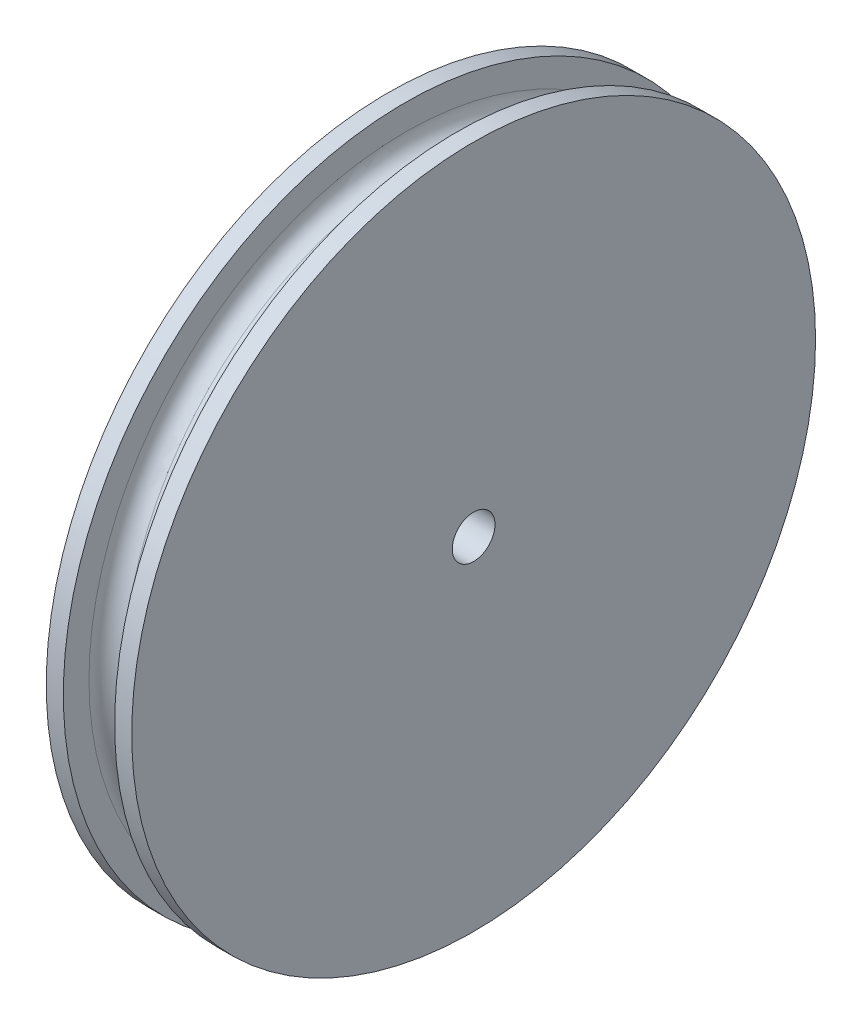
ISO-10303-21;
HEADER;
FILE_DESCRIPTION(('STEP AP214'),'2;1');
FILE_NAME('part.step','',(''),(''),'','','');
FILE_SCHEMA(('AUTOMOTIVE_DESIGN { 1 0 10303 214 1 1 1 1 }'));
ENDSEC;
DATA;
#1=APPLICATION_CONTEXT('core data for automotive mechanical design processes');
#2=APPLICATION_PROTOCOL_DEFINITION('international standard','automotive_design',2000,#1);
#3=PRODUCT_CONTEXT('',#1,'mechanical');
#4=PRODUCT('Part','Part','',(#3));
#5=PRODUCT_RELATED_PRODUCT_CATEGORY('part','',(#4));
#6=PRODUCT_DEFINITION_FORMATION('','',#4);
#7=PRODUCT_DEFINITION_CONTEXT('part definition',#1,'design');
#8=PRODUCT_DEFINITION('design','',#6,#7);
#9=PRODUCT_DEFINITION_SHAPE('','',#8);
#10=(LENGTH_UNIT() NAMED_UNIT(*) SI_UNIT(.MILLI.,.METRE.));
#11=(NAMED_UNIT(*) PLANE_ANGLE_UNIT() SI_UNIT($,.RADIAN.));
#12=(NAMED_UNIT(*) SI_UNIT($,.STERADIAN.) SOLID_ANGLE_UNIT());
#13=UNCERTAINTY_MEASURE_WITH_UNIT(LENGTH_MEASURE(1.E-05),#10,'distance_accuracy_value','');
#14=(GEOMETRIC_REPRESENTATION_CONTEXT(3) GLOBAL_UNCERTAINTY_ASSIGNED_CONTEXT((#13)) GLOBAL_UNIT_ASSIGNED_CONTEXT((#10,
#11,#12)) REPRESENTATION_CONTEXT('',''));
#15=CARTESIAN_POINT('',(0.,0.,0.));
#16=DIRECTION('',(0.,0.,1.));
#17=DIRECTION('',(1.,0.,0.));
#18=AXIS2_PLACEMENT_3D('',#15,#16,#17);
#19=CARTESIAN_POINT('',(6.35,0.,0.));
#20=DIRECTION('',(-1.,0.,0.));
#21=DIRECTION('',(0.,0.,1.));
#22=AXIS2_PLACEMENT_3D('',#19,#20,#21);
#23=CYLINDRICAL_SURFACE('',#22,50.8);
#24=CARTESIAN_POINT('',(-6.35,0.,0.));
#25=DIRECTION('',(1.,0.,0.));
#26=DIRECTION('',(0.,0.,-1.));
#27=AXIS2_PLACEMENT_3D('',#24,#25,#26);
#28=CIRCLE('',#27,50.8);
#29=CARTESIAN_POINT('',(-6.35,0.,-50.8));
#30=VERTEX_POINT('',#29);
#31=EDGE_CURVE('E69',#30,#30,#28,.T.);
#32=ORIENTED_EDGE('',*,*,#31,.T.);
#33=EDGE_LOOP('',(#32));
#34=FACE_BOUND('',#33,.T.);
#35=CARTESIAN_POINT('',(-3.81,0.,0.));
#36=DIRECTION('',(1.,0.,0.));
#37=DIRECTION('',(0.,0.,-1.));
#38=AXIS2_PLACEMENT_3D('',#35,#36,#37);
#39=CIRCLE('',#38,50.8);
#40=CARTESIAN_POINT('',(-3.81,0.,-50.8));
#41=VERTEX_POINT('',#40);
#42=EDGE_CURVE('E73',#41,#41,#39,.T.);
#43=ORIENTED_EDGE('',*,*,#42,.F.);
#44=EDGE_LOOP('',(#43));
#45=FACE_BOUND('',#44,.T.);
#46=ADVANCED_FACE('F39',(#34,#45),#23,.T.);
#47=CARTESIAN_POINT('',(3.81,0.,0.));
#48=DIRECTION('',(1.,0.,0.));
#49=DIRECTION('',(0.,0.,-1.));
#50=AXIS2_PLACEMENT_3D('',#47,#48,#49);
#51=CIRCLE('',#50,50.8);
#52=CARTESIAN_POINT('',(3.81,0.,-50.8));
#53=VERTEX_POINT('',#52);
#54=EDGE_CURVE('E80',#53,#53,#51,.T.);
#55=ORIENTED_EDGE('',*,*,#54,.T.);
#56=EDGE_LOOP('',(#55));
#57=FACE_BOUND('',#56,.T.);
#58=CARTESIAN_POINT('',(6.35,0.,0.));
#59=DIRECTION('',(1.,0.,0.));
#60=DIRECTION('',(0.,0.,-1.));
#61=AXIS2_PLACEMENT_3D('',#58,#59,#60);
#62=CIRCLE('',#61,50.8);
#63=CARTESIAN_POINT('',(6.35,0.,-50.8));
#64=VERTEX_POINT('',#63);
#65=EDGE_CURVE('E68',#64,#64,#62,.T.);
#66=ORIENTED_EDGE('',*,*,#65,.F.);
#67=EDGE_LOOP('',(#66));
#68=FACE_BOUND('',#67,.T.);
#69=ADVANCED_FACE('F91',(#57,#68),#23,.T.);
#70=CARTESIAN_POINT('',(6.35,0.,0.));
#71=DIRECTION('',(-1.,0.,0.));
#72=DIRECTION('',(0.,0.,1.));
#73=AXIS2_PLACEMENT_3D('',#70,#71,#72);
#74=CYLINDRICAL_SURFACE('',#73,3.175);
#75=CARTESIAN_POINT('',(6.35,0.,0.));
#76=DIRECTION('',(1.,0.,0.));
#77=DIRECTION('',(0.,0.,-1.));
#78=AXIS2_PLACEMENT_3D('',#75,#76,#77);
#79=CIRCLE('',#78,3.175);
#80=CARTESIAN_POINT('',(6.35,0.,-3.175));
#81=VERTEX_POINT('',#80);
#82=EDGE_CURVE('E63',#81,#81,#79,.T.);
#83=ORIENTED_EDGE('',*,*,#82,.T.);
#84=EDGE_LOOP('',(#83));
#85=FACE_BOUND('',#84,.T.);
#86=CARTESIAN_POINT('',(-6.35,0.,0.));
#87=DIRECTION('',(1.,0.,0.));
#88=DIRECTION('',(0.,0.,-1.));
#89=AXIS2_PLACEMENT_3D('',#86,#87,#88);
#90=CIRCLE('',#89,3.175);
#91=CARTESIAN_POINT('',(-6.35,0.,-3.175));
#92=VERTEX_POINT('',#91);
#93=EDGE_CURVE('E64',#92,#92,#90,.T.);
#94=ORIENTED_EDGE('',*,*,#93,.F.);
#95=EDGE_LOOP('',(#94));
#96=FACE_BOUND('',#95,.T.);
#97=ADVANCED_FACE('F97',(#85,#96),#74,.F.);
#98=CARTESIAN_POINT('',(6.35,0.,0.));
#99=DIRECTION('',(1.,0.,0.));
#100=DIRECTION('',(0.,0.,-1.));
#101=AXIS2_PLACEMENT_3D('',#98,#99,#100);
#102=PLANE('',#101);
#103=ORIENTED_EDGE('',*,*,#65,.T.);
#104=EDGE_LOOP('',(#103));
#105=FACE_BOUND('',#104,.T.);
#106=ORIENTED_EDGE('',*,*,#82,.F.);
#107=EDGE_LOOP('',(#106));
#108=FACE_BOUND('',#107,.T.);
#109=ADVANCED_FACE('F119',(#105,#108),#102,.T.);
#110=CARTESIAN_POINT('',(-6.35,0.,0.));
#111=DIRECTION('',(1.,0.,0.));
#112=DIRECTION('',(0.,0.,-1.));
#113=AXIS2_PLACEMENT_3D('',#110,#111,#112);
#114=PLANE('',#113);
#115=ORIENTED_EDGE('',*,*,#31,.F.);
#116=EDGE_LOOP('',(#115));
#117=FACE_BOUND('',#116,.T.);
#118=ORIENTED_EDGE('',*,*,#93,.T.);
#119=EDGE_LOOP('',(#118));
#120=FACE_BOUND('',#119,.T.);
#121=ADVANCED_FACE('F122',(#117,#120),#114,.F.);
#122=CARTESIAN_POINT('',(-3.81,0.,0.));
#123=DIRECTION('',(1.,0.,0.));
#124=DIRECTION('',(0.,0.,-1.));
#125=AXIS2_PLACEMENT_3D('',#122,#123,#124);
#126=CYLINDRICAL_SURFACE('',#125,44.45);
#127=CARTESIAN_POINT('',(1.27,0.,0.));
#128=DIRECTION('',(1.,0.,0.));
#129=DIRECTION('',(0.,0.,-1.));
#130=AXIS2_PLACEMENT_3D('',#127,#128,#129);
#131=CIRCLE('',#130,44.45);
#132=CARTESIAN_POINT('',(1.27,0.,-44.45));
#133=VERTEX_POINT('',#132);
#134=EDGE_CURVE('E47',#133,#133,#131,.F.);
#135=CARTESIAN_POINT('',(-1.27,0.,0.));
#136=DIRECTION('',(1.,0.,0.));
#137=DIRECTION('',(0.,0.,-1.));
#138=AXIS2_PLACEMENT_3D('',#135,#136,#137);
#139=CIRCLE('',#138,44.45);
#140=CARTESIAN_POINT('',(-1.27,0.,-44.45));
#141=VERTEX_POINT('',#140);
#142=EDGE_CURVE('E52',#141,#141,#139,.T.);
#143=CARTESIAN_POINT('',(1.27,0.,-44.45));
#144=CARTESIAN_POINT('',(1.24354166666667,0.,-44.45));
#145=CARTESIAN_POINT('',(1.21708333333333,0.,-44.45));
#146=CARTESIAN_POINT('',(1.16416666666667,0.,-44.45));
#147=CARTESIAN_POINT('',(1.13770833333333,0.,-44.45));
#148=CARTESIAN_POINT('',(1.08479166666667,0.,-44.45));
#149=CARTESIAN_POINT('',(1.05833333333333,0.,-44.45));
#150=CARTESIAN_POINT('',(1.00541666666667,0.,-44.45));
#151=CARTESIAN_POINT('',(0.978958333333332,0.,-44.45));
#152=CARTESIAN_POINT('',(0.926041666666666,0.,-44.45));
#153=CARTESIAN_POINT('',(0.899583333333333,0.,-44.45));
#154=CARTESIAN_POINT('',(0.846666666666666,0.,-44.45));
#155=CARTESIAN_POINT('',(0.820208333333332,0.,-44.45));
#156=CARTESIAN_POINT('',(0.767291666666666,0.,-44.45));
#157=CARTESIAN_POINT('',(0.740833333333332,0.,-44.45));
#158=CARTESIAN_POINT('',(0.687916666666666,0.,-44.45));
#159=CARTESIAN_POINT('',(0.661458333333332,0.,-44.45));
#160=CARTESIAN_POINT('',(0.608541666666666,0.,-44.45));
#161=CARTESIAN_POINT('',(0.582083333333333,0.,-44.45));
#162=CARTESIAN_POINT('',(0.529166666666666,0.,-44.45));
#163=CARTESIAN_POINT('',(0.502708333333333,0.,-44.45));
#164=CARTESIAN_POINT('',(0.449791666666666,0.,-44.45));
#165=CARTESIAN_POINT('',(0.423333333333333,0.,-44.45));
#166=CARTESIAN_POINT('',(0.370416666666666,0.,-44.45));
#167=CARTESIAN_POINT('',(0.343958333333333,0.,-44.45));
#168=CARTESIAN_POINT('',(0.291041666666666,0.,-44.45));
#169=CARTESIAN_POINT('',(0.264583333333333,0.,-44.45));
#170=CARTESIAN_POINT('',(0.211666666666666,0.,-44.45));
#171=CARTESIAN_POINT('',(0.185208333333333,0.,-44.45));
#172=CARTESIAN_POINT('',(0.132291666666666,0.,-44.45));
#173=CARTESIAN_POINT('',(0.105833333333333,0.,-44.45));
#174=CARTESIAN_POINT('',(0.0529166666666667,0.,-44.45));
#175=CARTESIAN_POINT('',(0.0264583333333333,0.,-44.45));
#176=CARTESIAN_POINT('',(-0.0264583333333333,0.,-44.45));
#177=CARTESIAN_POINT('',(-0.0529166666666667,0.,-44.45));
#178=CARTESIAN_POINT('',(-0.105833333333333,0.,-44.45));
#179=CARTESIAN_POINT('',(-0.132291666666667,0.,-44.45));
#180=CARTESIAN_POINT('',(-0.185208333333333,0.,-44.45));
#181=CARTESIAN_POINT('',(-0.211666666666666,0.,-44.45));
#182=CARTESIAN_POINT('',(-0.264583333333333,0.,-44.45));
#183=CARTESIAN_POINT('',(-0.291041666666667,0.,-44.45));
#184=CARTESIAN_POINT('',(-0.343958333333333,0.,-44.45));
#185=CARTESIAN_POINT('',(-0.370416666666666,0.,-44.45));
#186=CARTESIAN_POINT('',(-0.423333333333333,0.,-44.45));
#187=CARTESIAN_POINT('',(-0.449791666666666,0.,-44.45));
#188=CARTESIAN_POINT('',(-0.502708333333333,0.,-44.45));
#189=CARTESIAN_POINT('',(-0.529166666666666,0.,-44.45));
#190=CARTESIAN_POINT('',(-0.582083333333333,0.,-44.45));
#191=CARTESIAN_POINT('',(-0.608541666666666,0.,-44.45));
#192=CARTESIAN_POINT('',(-0.661458333333333,0.,-44.45));
#193=CARTESIAN_POINT('',(-0.687916666666666,0.,-44.45));
#194=CARTESIAN_POINT('',(-0.740833333333333,0.,-44.45));
#195=CARTESIAN_POINT('',(-0.767291666666666,0.,-44.45));
#196=CARTESIAN_POINT('',(-0.820208333333333,0.,-44.45));
#197=CARTESIAN_POINT('',(-0.846666666666666,0.,-44.45));
#198=CARTESIAN_POINT('',(-0.899583333333333,0.,-44.45));
#199=CARTESIAN_POINT('',(-0.926041666666666,0.,-44.45));
#200=CARTESIAN_POINT('',(-0.978958333333333,0.,-44.45));
#201=CARTESIAN_POINT('',(-1.00541666666667,0.,-44.45));
#202=CARTESIAN_POINT('',(-1.05833333333333,0.,-44.45));
#203=CARTESIAN_POINT('',(-1.08479166666667,0.,-44.45));
#204=CARTESIAN_POINT('',(-1.13770833333333,0.,-44.45));
#205=CARTESIAN_POINT('',(-1.16416666666667,0.,-44.45));
#206=CARTESIAN_POINT('',(-1.21708333333333,0.,-44.45));
#207=CARTESIAN_POINT('',(-1.24354166666667,0.,-44.45));
#208=CARTESIAN_POINT('',(-1.27,0.,-44.45));
#209=B_SPLINE_CURVE_WITH_KNOTS('',3,(#143,#144,#145,#146,#147,#148,#149,#150,#151,#152,#153,
#154,#155,#156,#157,#158,#159,#160,#161,#162,#163,#164,#165,#166,#167,#168,#169,#170,#171,#172,
#173,#174,#175,#176,#177,#178,#179,#180,#181,#182,#183,#184,#185,#186,#187,#188,#189,#190,#191,
#192,#193,#194,#195,#196,#197,#198,#199,#200,#201,#202,#203,#204,#205,#206,#207,#208),
.UNSPECIFIED.,.F.,.F.,(4,2,2,2,2,2,2,2,2,2,2,2,2,2,2,2,2,2,2,2,2,2,2,2,2,2,2,2,2,2,2,2,4),(0.,
0.0793749999999996,0.15875,0.238125,0.3175,0.396875,0.47625,0.555625,0.635,0.714375,
0.793749999999999,0.873125,0.952499999999999,1.031875,1.11125,1.190625,1.27,1.349375,1.42875,
1.508125,1.5875,1.666875,1.74625,1.825625,1.905,1.984375,2.06375,2.143125,2.2225,2.301875,
2.38125,2.460625,2.54),.UNSPECIFIED.);
#210=EDGE_CURVE('BSEAM131',#133,#141,#209,.T.);
#211=ORIENTED_EDGE('',*,*,#134,.T.);
#212=ORIENTED_EDGE('',*,*,#142,.T.);
#213=ORIENTED_EDGE('',*,*,#210,.T.);
#214=ORIENTED_EDGE('',*,*,#210,.F.);
#215=EDGE_LOOP('',(#211,#213,#212,#214));
#216=FACE_BOUND('',#215,.T.);
#217=ADVANCED_FACE('F131',(#216),#126,.T.);
#218=CARTESIAN_POINT('',(-3.81,0.,0.));
#219=DIRECTION('',(1.,0.,0.));
#220=DIRECTION('',(0.,0.,-1.));
#221=AXIS2_PLACEMENT_3D('',#218,#219,#220);
#222=PLANE('',#221);
#223=CARTESIAN_POINT('',(-3.81,0.,0.));
#224=DIRECTION('',(1.,0.,0.));
#225=DIRECTION('',(0.,0.,-1.));
#226=AXIS2_PLACEMENT_3D('',#223,#224,#225);
#227=CIRCLE('',#226,46.99);
#228=CARTESIAN_POINT('',(-3.81,0.,-46.99));
#229=VERTEX_POINT('',#228);
#230=EDGE_CURVE('E10',#229,#229,#227,.F.);
#231=ORIENTED_EDGE('',*,*,#230,.T.);
#232=EDGE_LOOP('',(#231));
#233=FACE_BOUND('',#232,.T.);
#234=ORIENTED_EDGE('',*,*,#42,.T.);
#235=EDGE_LOOP('',(#234));
#236=FACE_BOUND('',#235,.T.);
#237=ADVANCED_FACE('F88',(#233,#236),#222,.T.);
#238=CARTESIAN_POINT('',(3.81,0.,0.));
#239=DIRECTION('',(1.,0.,0.));
#240=DIRECTION('',(0.,0.,-1.));
#241=AXIS2_PLACEMENT_3D('',#238,#239,#240);
#242=PLANE('',#241);
#243=CARTESIAN_POINT('',(3.81,0.,0.));
#244=DIRECTION('',(1.,0.,0.));
#245=DIRECTION('',(0.,0.,-1.));
#246=AXIS2_PLACEMENT_3D('',#243,#244,#245);
#247=CIRCLE('',#246,46.99);
#248=CARTESIAN_POINT('',(3.81,0.,-46.99));
#249=VERTEX_POINT('',#248);
#250=EDGE_CURVE('E57',#249,#249,#247,.T.);
#251=ORIENTED_EDGE('',*,*,#250,.T.);
#252=EDGE_LOOP('',(#251));
#253=FACE_BOUND('',#252,.T.);
#254=ORIENTED_EDGE('',*,*,#54,.F.);
#255=EDGE_LOOP('',(#254));
#256=FACE_BOUND('',#255,.T.);
#257=ADVANCED_FACE('F103',(#253,#256),#242,.F.);
#258=CARTESIAN_POINT('',(1.27,0.,0.));
#259=DIRECTION('',(1.,0.,0.));
#260=DIRECTION('',(0.,0.,-1.));
#261=AXIS2_PLACEMENT_3D('',#258,#259,#260);
#262=TOROIDAL_SURFACE('',#261,46.99,2.54);
#263=ORIENTED_EDGE('',*,*,#134,.F.);
#264=EDGE_LOOP('',(#263));
#265=FACE_BOUND('',#264,.T.);
#266=ORIENTED_EDGE('',*,*,#250,.F.);
#267=EDGE_LOOP('',(#266));
#268=FACE_BOUND('',#267,.T.);
#269=ADVANCED_FACE('F101',(#265,#268),#262,.F.);
#270=CARTESIAN_POINT('',(-1.27,0.,0.));
#271=DIRECTION('',(1.,0.,0.));
#272=DIRECTION('',(0.,0.,-1.));
#273=AXIS2_PLACEMENT_3D('',#270,#271,#272);
#274=TOROIDAL_SURFACE('',#273,46.99,2.54);
#275=ORIENTED_EDGE('',*,*,#230,.F.);
#276=EDGE_LOOP('',(#275));
#277=FACE_BOUND('',#276,.T.);
#278=ORIENTED_EDGE('',*,*,#142,.F.);
#279=EDGE_LOOP('',(#278));
#280=FACE_BOUND('',#279,.T.);
#281=ADVANCED_FACE('F41',(#277,#280),#274,.F.);
#282=CLOSED_SHELL('',(#46,#69,#97,#109,#121,#217,#237,#257,#269,#281));
#283=MANIFOLD_SOLID_BREP('B2',#282);
#284=ADVANCED_BREP_SHAPE_REPRESENTATION('',(#18,#283),#14);
#285=SHAPE_DEFINITION_REPRESENTATION(#9,#284);
ENDSEC;
END-ISO-10303-21;
